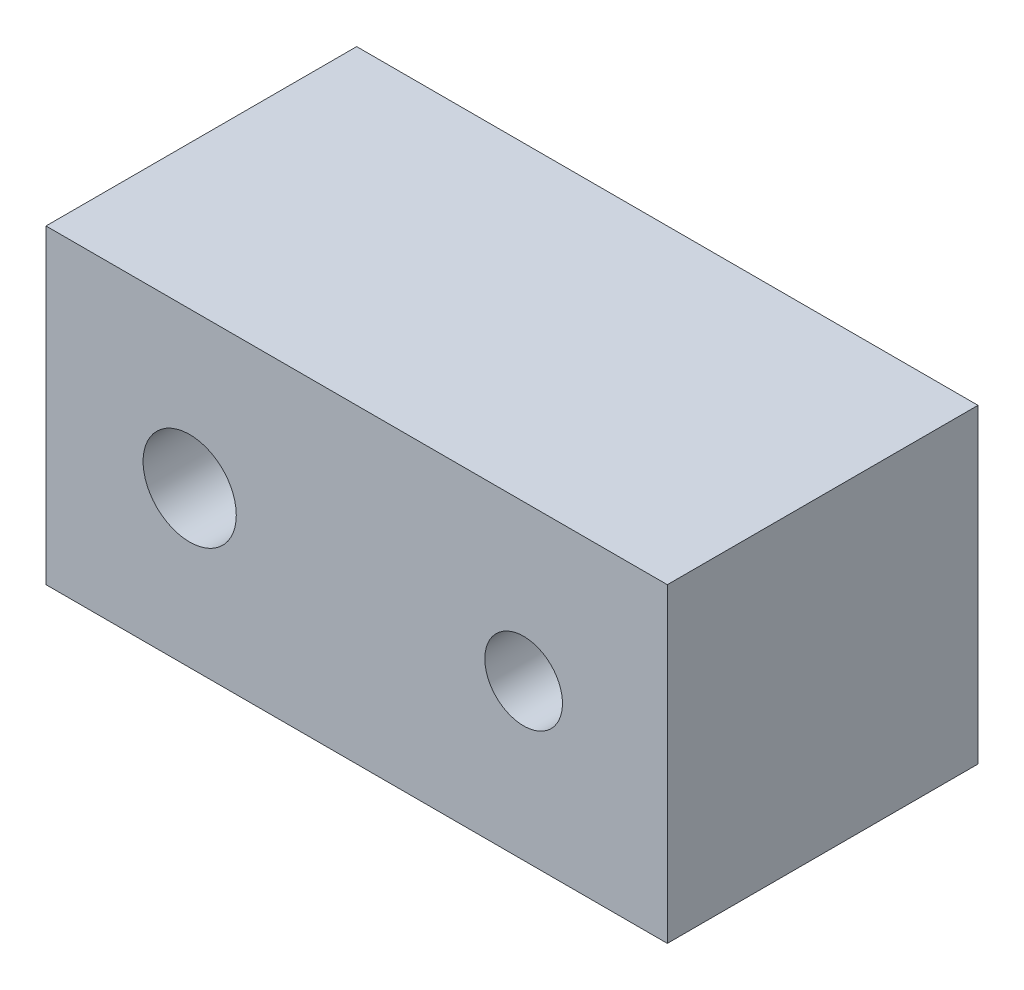
ISO-10303-21;
HEADER;
FILE_DESCRIPTION(('STEP AP214'),'2;1');
FILE_NAME('part.step','',(''),(''),'','','');
FILE_SCHEMA(('AUTOMOTIVE_DESIGN { 1 0 10303 214 1 1 1 1 }'));
ENDSEC;
DATA;
#1=APPLICATION_CONTEXT('core data for automotive mechanical design processes');
#2=APPLICATION_PROTOCOL_DEFINITION('international standard','automotive_design',2000,#1);
#3=PRODUCT_CONTEXT('',#1,'mechanical');
#4=PRODUCT('Part','Part','',(#3));
#5=PRODUCT_RELATED_PRODUCT_CATEGORY('part','',(#4));
#6=PRODUCT_DEFINITION_FORMATION('','',#4);
#7=PRODUCT_DEFINITION_CONTEXT('part definition',#1,'design');
#8=PRODUCT_DEFINITION('design','',#6,#7);
#9=PRODUCT_DEFINITION_SHAPE('','',#8);
#10=(LENGTH_UNIT() NAMED_UNIT(*) SI_UNIT(.MILLI.,.METRE.));
#11=(NAMED_UNIT(*) PLANE_ANGLE_UNIT() SI_UNIT($,.RADIAN.));
#12=(NAMED_UNIT(*) SI_UNIT($,.STERADIAN.) SOLID_ANGLE_UNIT());
#13=UNCERTAINTY_MEASURE_WITH_UNIT(LENGTH_MEASURE(1.E-05),#10,'distance_accuracy_value','');
#14=(GEOMETRIC_REPRESENTATION_CONTEXT(3) GLOBAL_UNCERTAINTY_ASSIGNED_CONTEXT((#13)) GLOBAL_UNIT_ASSIGNED_CONTEXT((#10,
#11,#12)) REPRESENTATION_CONTEXT('',''));
#15=CARTESIAN_POINT('',(0.,0.,0.));
#16=DIRECTION('',(0.,0.,1.));
#17=DIRECTION('',(1.,0.,0.));
#18=AXIS2_PLACEMENT_3D('',#15,#16,#17);
#19=CARTESIAN_POINT('',(20.,10.,20.));
#20=DIRECTION('',(-1.,0.,0.));
#21=DIRECTION('',(0.,-1.,0.));
#22=AXIS2_PLACEMENT_3D('',#19,#20,#21);
#23=PLANE('',#22);
#24=DIRECTION('',(0.,1.,0.));
#25=VECTOR('',#24,1.);
#26=CARTESIAN_POINT('',(20.,10.,0.));
#27=LINE('',#26,#25);
#28=CARTESIAN_POINT('',(20.,-10.,0.));
#29=VERTEX_POINT('',#28);
#30=CARTESIAN_POINT('',(20.,10.,0.));
#31=VERTEX_POINT('',#30);
#32=EDGE_CURVE('E100',#29,#31,#27,.T.);
#33=ORIENTED_EDGE('',*,*,#32,.T.);
#34=DIRECTION('',(0.,0.,-1.));
#35=VECTOR('',#34,1.);
#36=CARTESIAN_POINT('',(20.,10.,20.));
#37=LINE('',#36,#35);
#38=CARTESIAN_POINT('',(20.,10.,20.));
#39=VERTEX_POINT('',#38);
#40=EDGE_CURVE('E11',#39,#31,#37,.T.);
#41=ORIENTED_EDGE('',*,*,#40,.F.);
#42=DIRECTION('',(0.,1.,0.));
#43=VECTOR('',#42,1.);
#44=CARTESIAN_POINT('',(20.,10.,20.));
#45=LINE('',#44,#43);
#46=CARTESIAN_POINT('',(20.,-10.,20.));
#47=VERTEX_POINT('',#46);
#48=EDGE_CURVE('E88',#47,#39,#45,.T.);
#49=ORIENTED_EDGE('',*,*,#48,.F.);
#50=DIRECTION('',(0.,0.,-1.));
#51=VECTOR('',#50,1.);
#52=CARTESIAN_POINT('',(20.,-10.,20.));
#53=LINE('',#52,#51);
#54=EDGE_CURVE('E96',#47,#29,#53,.T.);
#55=ORIENTED_EDGE('',*,*,#54,.T.);
#56=EDGE_LOOP('',(#33,#41,#49,#55));
#57=FACE_BOUND('',#56,.T.);
#58=ADVANCED_FACE('F37',(#57),#23,.F.);
#59=CARTESIAN_POINT('',(-20.,10.,20.));
#60=DIRECTION('',(0.,-1.,0.));
#61=DIRECTION('',(0.,0.,-1.));
#62=AXIS2_PLACEMENT_3D('',#59,#60,#61);
#63=PLANE('',#62);
#64=DIRECTION('',(-1.,0.,0.));
#65=VECTOR('',#64,1.);
#66=CARTESIAN_POINT('',(-20.,10.,0.));
#67=LINE('',#66,#65);
#68=CARTESIAN_POINT('',(-20.,10.,0.));
#69=VERTEX_POINT('',#68);
#70=EDGE_CURVE('E92',#31,#69,#67,.T.);
#71=ORIENTED_EDGE('',*,*,#70,.T.);
#72=DIRECTION('',(0.,0.,-1.));
#73=VECTOR('',#72,1.);
#74=CARTESIAN_POINT('',(-20.,10.,20.));
#75=LINE('',#74,#73);
#76=CARTESIAN_POINT('',(-20.,10.,20.));
#77=VERTEX_POINT('',#76);
#78=EDGE_CURVE('E45',#77,#69,#75,.T.);
#79=ORIENTED_EDGE('',*,*,#78,.F.);
#80=DIRECTION('',(-1.,0.,0.));
#81=VECTOR('',#80,1.);
#82=CARTESIAN_POINT('',(-20.,10.,20.));
#83=LINE('',#82,#81);
#84=EDGE_CURVE('E83',#39,#77,#83,.T.);
#85=ORIENTED_EDGE('',*,*,#84,.F.);
#86=ORIENTED_EDGE('',*,*,#40,.T.);
#87=EDGE_LOOP('',(#71,#79,#85,#86));
#88=FACE_BOUND('',#87,.T.);
#89=ADVANCED_FACE('F91',(#88),#63,.F.);
#90=CARTESIAN_POINT('',(-20.,10.,20.));
#91=DIRECTION('',(1.,0.,0.));
#92=DIRECTION('',(0.,0.,-1.));
#93=AXIS2_PLACEMENT_3D('',#90,#91,#92);
#94=PLANE('',#93);
#95=DIRECTION('',(0.,-1.,0.));
#96=VECTOR('',#95,1.);
#97=CARTESIAN_POINT('',(-20.,10.,0.));
#98=LINE('',#97,#96);
#99=CARTESIAN_POINT('',(-20.,-10.,0.));
#100=VERTEX_POINT('',#99);
#101=EDGE_CURVE('E70',#69,#100,#98,.T.);
#102=ORIENTED_EDGE('',*,*,#101,.T.);
#103=DIRECTION('',(0.,0.,-1.));
#104=VECTOR('',#103,1.);
#105=CARTESIAN_POINT('',(-20.,-10.,20.));
#106=LINE('',#105,#104);
#107=CARTESIAN_POINT('',(-20.,-10.,20.));
#108=VERTEX_POINT('',#107);
#109=EDGE_CURVE('E93',#108,#100,#106,.T.);
#110=ORIENTED_EDGE('',*,*,#109,.F.);
#111=DIRECTION('',(0.,-1.,0.));
#112=VECTOR('',#111,1.);
#113=CARTESIAN_POINT('',(-20.,10.,20.));
#114=LINE('',#113,#112);
#115=EDGE_CURVE('E86',#77,#108,#114,.T.);
#116=ORIENTED_EDGE('',*,*,#115,.F.);
#117=ORIENTED_EDGE('',*,*,#78,.T.);
#118=EDGE_LOOP('',(#102,#110,#116,#117));
#119=FACE_BOUND('',#118,.T.);
#120=ADVANCED_FACE('F94',(#119),#94,.F.);
#121=CARTESIAN_POINT('',(-20.,-10.,20.));
#122=DIRECTION('',(0.,1.,0.));
#123=DIRECTION('',(0.,0.,1.));
#124=AXIS2_PLACEMENT_3D('',#121,#122,#123);
#125=PLANE('',#124);
#126=DIRECTION('',(1.,0.,0.));
#127=VECTOR('',#126,1.);
#128=CARTESIAN_POINT('',(-20.,-10.,0.));
#129=LINE('',#128,#127);
#130=EDGE_CURVE('E76',#100,#29,#129,.T.);
#131=ORIENTED_EDGE('',*,*,#130,.T.);
#132=ORIENTED_EDGE('',*,*,#54,.F.);
#133=DIRECTION('',(1.,0.,0.));
#134=VECTOR('',#133,1.);
#135=CARTESIAN_POINT('',(-20.,-10.,20.));
#136=LINE('',#135,#134);
#137=EDGE_CURVE('E53',#108,#47,#136,.T.);
#138=ORIENTED_EDGE('',*,*,#137,.F.);
#139=ORIENTED_EDGE('',*,*,#109,.T.);
#140=EDGE_LOOP('',(#131,#132,#138,#139));
#141=FACE_BOUND('',#140,.T.);
#142=ADVANCED_FACE('F108',(#141),#125,.F.);
#143=CARTESIAN_POINT('',(0.,0.,20.));
#144=DIRECTION('',(0.,0.,1.));
#145=DIRECTION('',(1.,0.,0.));
#146=AXIS2_PLACEMENT_3D('',#143,#144,#145);
#147=PLANE('',#146);
#148=CARTESIAN_POINT('',(-10.75,0.,20.));
#149=DIRECTION('',(0.,0.,1.));
#150=DIRECTION('',(1.,0.,0.));
#151=AXIS2_PLACEMENT_3D('',#148,#149,#150);
#152=CIRCLE('',#151,3.);
#153=CARTESIAN_POINT('',(-7.75,0.,20.));
#154=VERTEX_POINT('',#153);
#155=EDGE_CURVE('E123',#154,#154,#152,.T.);
#156=ORIENTED_EDGE('',*,*,#155,.F.);
#157=EDGE_LOOP('',(#156));
#158=FACE_BOUND('',#157,.T.);
#159=CARTESIAN_POINT('',(10.75,0.,20.));
#160=DIRECTION('',(0.,0.,-1.));
#161=DIRECTION('',(-1.,0.,0.));
#162=AXIS2_PLACEMENT_3D('',#159,#160,#161);
#163=CIRCLE('',#162,2.5);
#164=CARTESIAN_POINT('',(8.25,0.,20.));
#165=VERTEX_POINT('',#164);
#166=EDGE_CURVE('E103',#165,#165,#163,.T.);
#167=ORIENTED_EDGE('',*,*,#166,.T.);
#168=EDGE_LOOP('',(#167));
#169=FACE_BOUND('',#168,.T.);
#170=ORIENTED_EDGE('',*,*,#48,.T.);
#171=ORIENTED_EDGE('',*,*,#84,.T.);
#172=ORIENTED_EDGE('',*,*,#115,.T.);
#173=ORIENTED_EDGE('',*,*,#137,.T.);
#174=EDGE_LOOP('',(#170,#171,#172,#173));
#175=FACE_BOUND('',#174,.T.);
#176=ADVANCED_FACE('F84',(#158,#169,#175),#147,.T.);
#177=CARTESIAN_POINT('',(0.,0.,0.));
#178=DIRECTION('',(0.,0.,1.));
#179=DIRECTION('',(1.,0.,0.));
#180=AXIS2_PLACEMENT_3D('',#177,#178,#179);
#181=PLANE('',#180);
#182=CARTESIAN_POINT('',(-10.75,0.,0.));
#183=DIRECTION('',(0.,0.,1.));
#184=DIRECTION('',(1.,0.,0.));
#185=AXIS2_PLACEMENT_3D('',#182,#183,#184);
#186=CIRCLE('',#185,3.);
#187=CARTESIAN_POINT('',(-7.75,0.,0.));
#188=VERTEX_POINT('',#187);
#189=EDGE_CURVE('E122',#188,#188,#186,.T.);
#190=ORIENTED_EDGE('',*,*,#189,.T.);
#191=EDGE_LOOP('',(#190));
#192=FACE_BOUND('',#191,.T.);
#193=CARTESIAN_POINT('',(10.75,0.,0.));
#194=DIRECTION('',(0.,0.,-1.));
#195=DIRECTION('',(-1.,0.,0.));
#196=AXIS2_PLACEMENT_3D('',#193,#194,#195);
#197=CIRCLE('',#196,3.025);
#198=CARTESIAN_POINT('',(7.725,0.,0.));
#199=VERTEX_POINT('',#198);
#200=EDGE_CURVE('E119',#199,#199,#197,.T.);
#201=ORIENTED_EDGE('',*,*,#200,.F.);
#202=EDGE_LOOP('',(#201));
#203=FACE_BOUND('',#202,.T.);
#204=ORIENTED_EDGE('',*,*,#32,.F.);
#205=ORIENTED_EDGE('',*,*,#130,.F.);
#206=ORIENTED_EDGE('',*,*,#101,.F.);
#207=ORIENTED_EDGE('',*,*,#70,.F.);
#208=EDGE_LOOP('',(#204,#205,#206,#207));
#209=FACE_BOUND('',#208,.T.);
#210=ADVANCED_FACE('F111',(#192,#203,#209),#181,.F.);
#211=CARTESIAN_POINT('',(10.75,0.,0.));
#212=DIRECTION('',(0.,0.,-1.));
#213=DIRECTION('',(-1.,0.,0.));
#214=AXIS2_PLACEMENT_3D('',#211,#212,#213);
#215=CYLINDRICAL_SURFACE('',#214,2.5);
#216=ORIENTED_EDGE('',*,*,#166,.F.);
#217=EDGE_LOOP('',(#216));
#218=FACE_BOUND('',#217,.T.);
#219=CARTESIAN_POINT('',(10.75,0.,0.525000000000003));
#220=DIRECTION('',(0.,0.,-1.));
#221=DIRECTION('',(-1.,0.,0.));
#222=AXIS2_PLACEMENT_3D('',#219,#220,#221);
#223=CIRCLE('',#222,2.5);
#224=CARTESIAN_POINT('',(8.25,0.,0.525000000000003));
#225=VERTEX_POINT('',#224);
#226=EDGE_CURVE('E116',#225,#225,#223,.T.);
#227=ORIENTED_EDGE('',*,*,#226,.T.);
#228=EDGE_LOOP('',(#227));
#229=FACE_BOUND('',#228,.T.);
#230=ADVANCED_FACE('F143',(#218,#229),#215,.F.);
#231=CARTESIAN_POINT('',(10.75,0.,0.));
#232=DIRECTION('',(0.,0.,-1.));
#233=DIRECTION('',(-1.,0.,0.));
#234=AXIS2_PLACEMENT_3D('',#231,#232,#233);
#235=CONICAL_SURFACE('',#234,3.025,0.785398163397445);
#236=ORIENTED_EDGE('',*,*,#226,.F.);
#237=EDGE_LOOP('',(#236));
#238=FACE_BOUND('',#237,.T.);
#239=ORIENTED_EDGE('',*,*,#200,.T.);
#240=EDGE_LOOP('',(#239));
#241=FACE_BOUND('',#240,.T.);
#242=ADVANCED_FACE('F134',(#238,#241),#235,.F.);
#243=CARTESIAN_POINT('',(-10.75,0.,0.));
#244=DIRECTION('',(0.,0.,1.));
#245=DIRECTION('',(1.,0.,0.));
#246=AXIS2_PLACEMENT_3D('',#243,#244,#245);
#247=CYLINDRICAL_SURFACE('',#246,3.);
#248=ORIENTED_EDGE('',*,*,#189,.F.);
#249=EDGE_LOOP('',(#248));
#250=FACE_BOUND('',#249,.T.);
#251=ORIENTED_EDGE('',*,*,#155,.T.);
#252=EDGE_LOOP('',(#251));
#253=FACE_BOUND('',#252,.T.);
#254=ADVANCED_FACE('F131',(#250,#253),#247,.F.);
#255=CLOSED_SHELL('',(#58,#89,#120,#142,#176,#210,#230,#242,#254));
#256=MANIFOLD_SOLID_BREP('B2',#255);
#257=ADVANCED_BREP_SHAPE_REPRESENTATION('',(#18,#256),#14);
#258=SHAPE_DEFINITION_REPRESENTATION(#9,#257);
ENDSEC;
END-ISO-10303-21;
